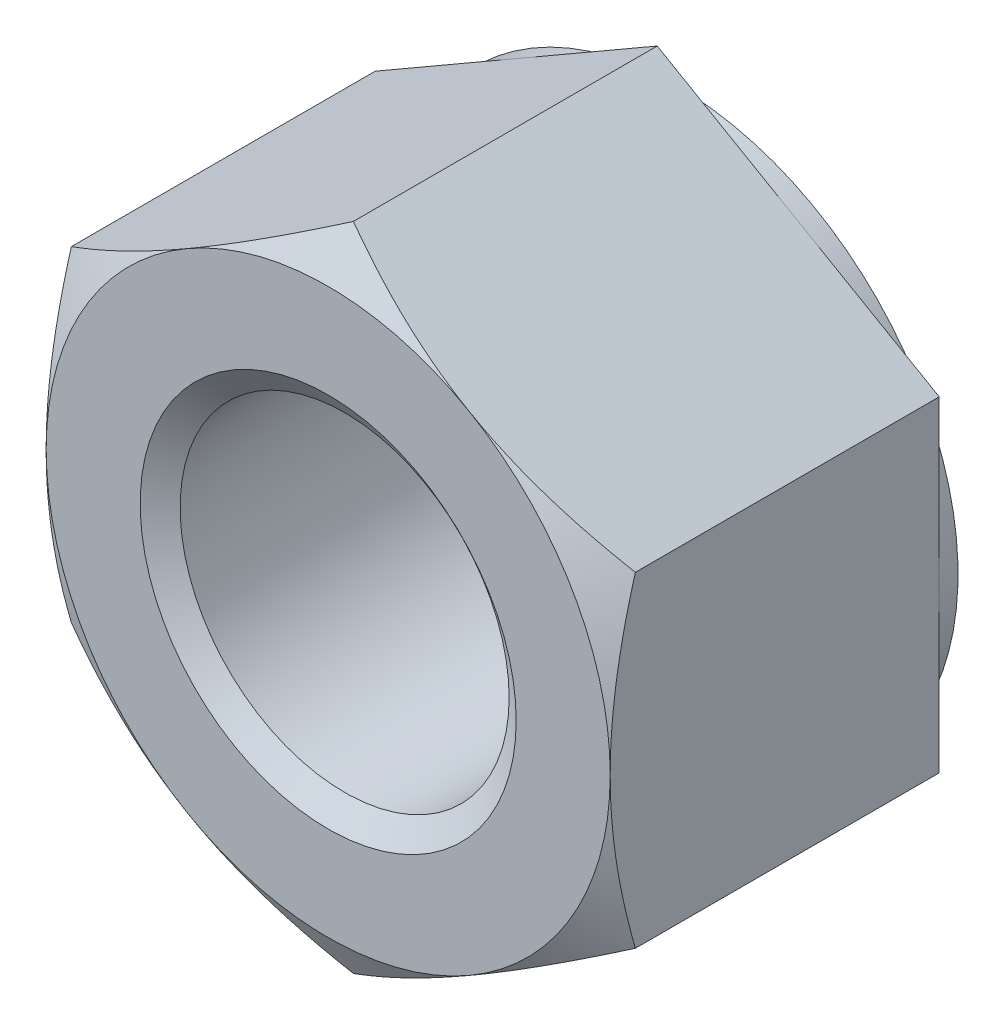
ISO-10303-21;
HEADER;
FILE_DESCRIPTION(('STEP AP214'),'2;1');
FILE_NAME('part.step','',(''),(''),'','','');
FILE_SCHEMA(('AUTOMOTIVE_DESIGN { 1 0 10303 214 1 1 1 1 }'));
ENDSEC;
DATA;
#1=APPLICATION_CONTEXT('core data for automotive mechanical design processes');
#2=APPLICATION_PROTOCOL_DEFINITION('international standard','automotive_design',2000,#1);
#3=PRODUCT_CONTEXT('',#1,'mechanical');
#4=PRODUCT('Part','Part','',(#3));
#5=PRODUCT_RELATED_PRODUCT_CATEGORY('part','',(#4));
#6=PRODUCT_DEFINITION_FORMATION('','',#4);
#7=PRODUCT_DEFINITION_CONTEXT('part definition',#1,'design');
#8=PRODUCT_DEFINITION('design','',#6,#7);
#9=PRODUCT_DEFINITION_SHAPE('','',#8);
#10=(LENGTH_UNIT() NAMED_UNIT(*) SI_UNIT(.MILLI.,.METRE.));
#11=(NAMED_UNIT(*) PLANE_ANGLE_UNIT() SI_UNIT($,.RADIAN.));
#12=(NAMED_UNIT(*) SI_UNIT($,.STERADIAN.) SOLID_ANGLE_UNIT());
#13=UNCERTAINTY_MEASURE_WITH_UNIT(LENGTH_MEASURE(1.E-05),#10,'distance_accuracy_value','');
#14=(GEOMETRIC_REPRESENTATION_CONTEXT(3) GLOBAL_UNCERTAINTY_ASSIGNED_CONTEXT((#13)) GLOBAL_UNIT_ASSIGNED_CONTEXT((#10,
#11,#12)) REPRESENTATION_CONTEXT('',''));
#15=CARTESIAN_POINT('',(0.,0.,0.));
#16=DIRECTION('',(0.,0.,1.));
#17=DIRECTION('',(1.,0.,0.));
#18=AXIS2_PLACEMENT_3D('',#15,#16,#17);
#19=CARTESIAN_POINT('',(0.,0.,-14.8));
#20=DIRECTION('',(0.,0.,1.));
#21=DIRECTION('',(1.,0.,0.));
#22=AXIS2_PLACEMENT_3D('',#19,#20,#21);
#23=CYLINDRICAL_SURFACE('',#22,7.);
#24=CARTESIAN_POINT('',(0.,0.,-0.700207538209714));
#25=DIRECTION('',(0.,0.,1.));
#26=DIRECTION('',(1.,0.,0.));
#27=AXIS2_PLACEMENT_3D('',#24,#25,#26);
#28=CIRCLE('',#27,7.);
#29=CARTESIAN_POINT('',(7.00000000000002,0.,-0.700207538209714));
#30=VERTEX_POINT('',#29);
#31=EDGE_CURVE('E167',#30,#30,#28,.F.);
#32=ORIENTED_EDGE('',*,*,#31,.F.);
#33=EDGE_LOOP('',(#32));
#34=FACE_BOUND('',#33,.T.);
#35=CARTESIAN_POINT('',(0.,0.,-14.0743924617903));
#36=DIRECTION('',(0.,0.,-1.));
#37=DIRECTION('',(-1.,0.,0.));
#38=AXIS2_PLACEMENT_3D('',#35,#36,#37);
#39=CIRCLE('',#38,7.);
#40=CARTESIAN_POINT('',(-7.00000000000002,0.,-14.0743924617903));
#41=VERTEX_POINT('',#40);
#42=EDGE_CURVE('E52',#41,#41,#39,.F.);
#43=ORIENTED_EDGE('',*,*,#42,.F.);
#44=EDGE_LOOP('',(#43));
#45=FACE_BOUND('',#44,.T.);
#46=ADVANCED_FACE('F47',(#34,#45),#23,.F.);
#47=CARTESIAN_POINT('',(0.,13.8564064605511,-14.8));
#48=DIRECTION('',(-0.500000000000003,0.866025403784441,0.));
#49=DIRECTION('',(-0.866025403784441,-0.500000000000003,0.));
#50=AXIS2_PLACEMENT_3D('',#47,#48,#49);
#51=PLANE('',#50);
#52=DIRECTION('',(0.,0.,1.));
#53=VECTOR('',#52,1.);
#54=CARTESIAN_POINT('',(-12.,6.9282032302755,-14.8));
#55=LINE('',#54,#53);
#56=CARTESIAN_POINT('',(-12.,6.9282032302755,-14.));
#57=VERTEX_POINT('',#56);
#58=CARTESIAN_POINT('',(-12.,6.9282032302755,-1.0717967697245));
#59=VERTEX_POINT('',#58);
#60=EDGE_CURVE('E325',#57,#59,#55,.T.);
#61=ORIENTED_EDGE('',*,*,#60,.T.);
#62=CARTESIAN_POINT('',(-12.0002,6.92808776022166,-1.07186343722449));
#63=CARTESIAN_POINT('',(-11.7364142047578,7.08038456011322,-0.983949632185901));
#64=CARTESIAN_POINT('',(-11.4716448806183,7.23324920067835,-0.900025997556721));
#65=CARTESIAN_POINT('',(-10.9399829834704,7.54020434011455,-0.741266218872904));
#66=CARTESIAN_POINT('',(-10.673089742707,7.69429522451419,-0.666433063673642));
#67=CARTESIAN_POINT('',(-9.86810959402106,8.15905073005032,-0.457017539854202));
#68=CARTESIAN_POINT('',(-9.32684492617496,8.4715500317341,-0.337903236722902));
#69=CARTESIAN_POINT('',(-8.51686717084506,8.93919090681143,-0.198231061003196));
#70=CARTESIAN_POINT('',(-8.25057389951868,9.0929353986951,-0.158443797040496));
#71=CARTESIAN_POINT('',(-7.71675440130321,9.40113622968847,-0.0917233692171395));
#72=CARTESIAN_POINT('',(-7.44922815078267,9.5555925824418,-0.0647904527678221));
#73=CARTESIAN_POINT('',(-6.9137296336747,9.86476279544474,-0.0244685919169799));
#74=CARTESIAN_POINT('',(-6.64575827793134,10.0194761298183,-0.0110635528823812));
#75=CARTESIAN_POINT('',(-6.109567267726,10.3290461538974,0.00191690624279675));
#76=CARTESIAN_POINT('',(-5.84134762119197,10.4839028390257,0.00149275363726585));
#77=CARTESIAN_POINT('',(-5.33991062121591,10.7734076259435,-0.0122200193427782));
#78=CARTESIAN_POINT('',(-5.10665750682228,10.908076374328,-0.0238359825785691));
#79=CARTESIAN_POINT('',(-4.64068775826929,11.1771041340894,-0.0573080088724415));
#80=CARTESIAN_POINT('',(-4.40797116322828,11.3114631228812,-0.0791647962662738));
#81=CARTESIAN_POINT('',(-3.94320092395709,11.5797983456357,-0.13273741654296));
#82=CARTESIAN_POINT('',(-3.71114798763804,11.7137741708858,-0.164461392492977));
#83=CARTESIAN_POINT('',(-3.24813003269506,11.9810977118117,-0.237211775670496));
#84=CARTESIAN_POINT('',(-3.01716508910649,12.1144453841659,-0.278238815183254));
#85=CARTESIAN_POINT('',(-2.31605804123636,12.5192297269845,-0.416311653281863));
#86=CARTESIAN_POINT('',(-1.84794625372149,12.7894941935171,-0.527124888339393));
#87=CARTESIAN_POINT('',(-0.91870289240859,13.3259930983137,-0.778625766937946));
#88=CARTESIAN_POINT('',(-0.457559420707853,13.5922344058352,-0.919254342659433));
#89=CARTESIAN_POINT('',(0.000200000000001717,13.856521930605,-1.07186343722449));
#90=B_SPLINE_CURVE_WITH_KNOTS('',3,(#62,#63,#64,#65,#66,#67,#68,#69,#70,#71,#72,#73,#74,#75,#76,
#77,#78,#79,#80,#81,#82,#83,#84,#85,#86,#87,#88,#89),.UNSPECIFIED.,.F.,.F.,(4,2,2,2,2,2,2,2,2,2,
2,2,2,4),(0.,0.951004872251243,1.90232158356438,3.8090046616137,4.73894551413572,
5.66890426477612,6.59775529889868,7.52657763276933,8.33514643820581,9.14377244252753,
9.9530675579977,10.7624176939264,12.4167102786893,14.0677556316692),.UNSPECIFIED.);
#91=CARTESIAN_POINT('',(-6.00000000000004,10.3923048454133,0.));
#92=VERTEX_POINT('',#91);
#93=EDGE_CURVE('E72',#59,#92,#90,.T.);
#94=ORIENTED_EDGE('',*,*,#93,.T.);
#95=CARTESIAN_POINT('',(0.,13.8564064605511,-1.0717967697245));
#96=VERTEX_POINT('',#95);
#97=EDGE_CURVE('E186',#92,#96,#90,.T.);
#98=ORIENTED_EDGE('',*,*,#97,.T.);
#99=DIRECTION('',(0.,0.,1.));
#100=VECTOR('',#99,1.);
#101=CARTESIAN_POINT('',(0.,13.8564064605511,-14.8));
#102=LINE('',#101,#100);
#103=CARTESIAN_POINT('',(0.,13.8564064605511,-14.));
#104=VERTEX_POINT('',#103);
#105=EDGE_CURVE('E308',#104,#96,#102,.T.);
#106=ORIENTED_EDGE('',*,*,#105,.F.);
#107=DIRECTION('',(-0.866025403784441,-0.500000000000003,0.));
#108=VECTOR('',#107,1.);
#109=CARTESIAN_POINT('',(0.,13.8564064605511,-14.));
#110=LINE('',#109,#108);
#111=CARTESIAN_POINT('',(-6.00000000000004,10.3923048454133,-14.));
#112=VERTEX_POINT('',#111);
#113=EDGE_CURVE('E293',#104,#112,#110,.T.);
#114=ORIENTED_EDGE('',*,*,#113,.T.);
#115=EDGE_CURVE('E288',#112,#57,#110,.T.);
#116=ORIENTED_EDGE('',*,*,#115,.T.);
#117=EDGE_LOOP('',(#61,#94,#98,#106,#114,#116));
#118=FACE_BOUND('',#117,.T.);
#119=ADVANCED_FACE('F49',(#118),#51,.T.);
#120=CARTESIAN_POINT('',(12.,6.9282032302755,-14.8));
#121=DIRECTION('',(0.500000000000003,0.866025403784441,0.));
#122=DIRECTION('',(-0.866025403784441,0.500000000000003,0.));
#123=AXIS2_PLACEMENT_3D('',#120,#121,#122);
#124=PLANE('',#123);
#125=ORIENTED_EDGE('',*,*,#105,.T.);
#126=CARTESIAN_POINT('',(-0.000199999999996563,13.856521930605,-1.07186343722449));
#127=CARTESIAN_POINT('',(0.263585795242252,13.7042251307134,-0.98394963218589));
#128=CARTESIAN_POINT('',(0.528355119381786,13.5513604901483,-0.900025997556702));
#129=CARTESIAN_POINT('',(1.06001701652965,13.2444053507121,-0.741266218872878));
#130=CARTESIAN_POINT('',(1.32691025729306,13.0903144663124,-0.666433063673616));
#131=CARTESIAN_POINT('',(2.13189040597901,12.6255589607763,-0.457017539854177));
#132=CARTESIAN_POINT('',(2.6731550738251,12.3130596590925,-0.337903236722872));
#133=CARTESIAN_POINT('',(3.48313282915501,11.8454187840152,-0.198231061003164));
#134=CARTESIAN_POINT('',(3.74942610048139,11.6916742921315,-0.158443797040464));
#135=CARTESIAN_POINT('',(4.28324559869686,11.3834734611381,-0.0917233692171084));
#136=CARTESIAN_POINT('',(4.5507718492174,11.2290171083848,-0.064790452767791));
#137=CARTESIAN_POINT('',(5.08627036632538,10.9198468953819,-0.0244685919169424));
#138=CARTESIAN_POINT('',(5.35424172206876,10.7651335610083,-0.0110635528823373));
#139=CARTESIAN_POINT('',(5.89043273227407,10.4555635369292,0.00191690624282098));
#140=CARTESIAN_POINT('',(6.15865237880807,10.3007068518009,0.00149275363726413));
#141=CARTESIAN_POINT('',(6.66008937878414,10.0112020648831,-0.0122200193427767));
#142=CARTESIAN_POINT('',(6.89334249317779,9.87653331649856,-0.0238359825785449));
#143=CARTESIAN_POINT('',(7.35931224173081,9.60750555673726,-0.0573080088724005));
#144=CARTESIAN_POINT('',(7.59202883677181,9.47314656794544,-0.0791647962662387));
#145=CARTESIAN_POINT('',(8.05679907604298,9.2048113451909,-0.13273741654293));
#146=CARTESIAN_POINT('',(8.28885201236204,9.07083551994085,-0.164461392492945));
#147=CARTESIAN_POINT('',(8.75186996730502,8.80351197901489,-0.237211775670463));
#148=CARTESIAN_POINT('',(8.98283491089358,8.67016430666067,-0.27823881518322));
#149=CARTESIAN_POINT('',(9.68394195876371,8.2653799638421,-0.416311653281827));
#150=CARTESIAN_POINT('',(10.1520537462786,7.99511549730956,-0.527124888339354));
#151=CARTESIAN_POINT('',(11.0812971075915,7.45861659251289,-0.778625766937911));
#152=CARTESIAN_POINT('',(11.5424405792922,7.19237528499143,-0.919254342659406));
#153=CARTESIAN_POINT('',(12.0002,6.92808776022166,-1.07186343722449));
#154=B_SPLINE_CURVE_WITH_KNOTS('',3,(#126,#127,#128,#129,#130,#131,#132,#133,#134,#135,#136,
#137,#138,#139,#140,#141,#142,#143,#144,#145,#146,#147,#148,#149,#150,#151,#152,#153),
.UNSPECIFIED.,.F.,.F.,(4,2,2,2,2,2,2,2,2,2,2,2,2,4),(0.,0.951004872251253,1.90232158356439,
3.80900466161372,4.73894551413575,5.66890426477615,6.59775529889872,7.52657763276937,
8.33514643820586,9.14377244252757,9.95306755799773,10.7624176939265,12.4167102786893,
14.0677556316692),.UNSPECIFIED.);
#155=CARTESIAN_POINT('',(6.00000000000004,10.3923048454133,0.));
#156=VERTEX_POINT('',#155);
#157=EDGE_CURVE('E183',#96,#156,#154,.T.);
#158=ORIENTED_EDGE('',*,*,#157,.T.);
#159=CARTESIAN_POINT('',(12.,6.92820323027553,-1.0717967697245));
#160=VERTEX_POINT('',#159);
#161=EDGE_CURVE('E160',#156,#160,#154,.T.);
#162=ORIENTED_EDGE('',*,*,#161,.T.);
#163=DIRECTION('',(0.,0.,1.));
#164=VECTOR('',#163,1.);
#165=CARTESIAN_POINT('',(12.,6.9282032302755,-14.8));
#166=LINE('',#165,#164);
#167=CARTESIAN_POINT('',(12.,6.9282032302755,-14.));
#168=VERTEX_POINT('',#167);
#169=EDGE_CURVE('E178',#168,#160,#166,.T.);
#170=ORIENTED_EDGE('',*,*,#169,.F.);
#171=DIRECTION('',(-0.866025403784441,0.500000000000003,0.));
#172=VECTOR('',#171,1.);
#173=CARTESIAN_POINT('',(12.,6.9282032302755,-14.));
#174=LINE('',#173,#172);
#175=CARTESIAN_POINT('',(6.00000000000004,10.3923048454133,-14.));
#176=VERTEX_POINT('',#175);
#177=EDGE_CURVE('E303',#168,#176,#174,.T.);
#178=ORIENTED_EDGE('',*,*,#177,.T.);
#179=EDGE_CURVE('E298',#176,#104,#174,.T.);
#180=ORIENTED_EDGE('',*,*,#179,.T.);
#181=EDGE_LOOP('',(#125,#158,#162,#170,#178,#180));
#182=FACE_BOUND('',#181,.T.);
#183=ADVANCED_FACE('F261',(#182),#124,.T.);
#184=CARTESIAN_POINT('',(12.,6.9282032302755,-14.8));
#185=DIRECTION('',(-1.,0.,0.));
#186=DIRECTION('',(0.,0.,1.));
#187=AXIS2_PLACEMENT_3D('',#184,#185,#186);
#188=PLANE('',#187);
#189=CARTESIAN_POINT('',(12.0000000000001,-18.3746159698766,-5.74232046372183));
#190=CARTESIAN_POINT('',(12.0000000000001,-18.1111918264859,-5.61498513923389));
#191=CARTESIAN_POINT('',(12.,-17.8474492817227,-5.48830883121234));
#192=CARTESIAN_POINT('',(12.,-17.3192601229197,-5.23642551678936));
#193=CARTESIAN_POINT('',(12.,-17.0548135011845,-5.11121852652884));
#194=CARTESIAN_POINT('',(12.,-16.2602391639796,-4.73799215348734));
#195=CARTESIAN_POINT('',(12.,-15.7289626157829,-4.49240888485756));
#196=CARTESIAN_POINT('',(12.,-14.659698083513,-4.0079188757381));
#197=CARTESIAN_POINT('',(12.,-14.1216890909037,-3.76905838470961));
#198=CARTESIAN_POINT('',(12.,-13.0412497182117,-3.30159295667769));
#199=CARTESIAN_POINT('',(12.,-12.4988195703414,-3.07298748509958));
#200=CARTESIAN_POINT('',(12.,-11.4019415707821,-2.62605165906471));
#201=CARTESIAN_POINT('',(12.,-10.8474279352457,-2.40788190707403));
#202=CARTESIAN_POINT('',(12.,-9.73185625315833,-1.98862863844566));
#203=CARTESIAN_POINT('',(12.,-9.17079748637073,-1.78754702277386));
#204=CARTESIAN_POINT('',(12.,-8.04241377293584,-1.40787575411279));
#205=CARTESIAN_POINT('',(12.,-7.47510504864868,-1.22923828322895));
#206=CARTESIAN_POINT('',(12.,-6.33236790679921,-0.900248091383252));
#207=CARTESIAN_POINT('',(12.,-5.75694211908223,-0.749886425780382));
#208=CARTESIAN_POINT('',(12.,-4.88760620841683,-0.551055055862476));
#209=CARTESIAN_POINT('',(12.,-4.59673300881532,-0.489219616047522));
#210=CARTESIAN_POINT('',(12.,-4.01305048396675,-0.375428819843002));
#211=CARTESIAN_POINT('',(12.,-3.7202412010005,-0.323473248426317));
#212=CARTESIAN_POINT('',(12.,-3.13287727735238,-0.230362398208384));
#213=CARTESIAN_POINT('',(12.,-2.83832249610625,-0.189208001647554));
#214=CARTESIAN_POINT('',(12.,-2.24782315371645,-0.118528970775321));
#215=CARTESIAN_POINT('',(12.,-1.95187864865479,-0.0890038711785699));
#216=CARTESIAN_POINT('',(12.,-1.36089234495212,-0.0423753881209493));
#217=CARTESIAN_POINT('',(12.,-1.06585670022768,-0.0251945164064824));
#218=CARTESIAN_POINT('',(12.,-0.475323226777268,-0.00334573482666582));
#219=CARTESIAN_POINT('',(12.,-0.179825404103191,0.00132233753524057));
#220=CARTESIAN_POINT('',(12.,0.411018209391825,-0.00196522741275844));
#221=CARTESIAN_POINT('',(12.,0.706364019605425,-0.00991732191377093));
#222=CARTESIAN_POINT('',(12.,1.29646300031969,-0.0382476009171538));
#223=CARTESIAN_POINT('',(12.,1.59121614048714,-0.058626405962484));
#224=CARTESIAN_POINT('',(12.,2.30560702878384,-0.122652790995235));
#225=CARTESIAN_POINT('',(12.,2.72469590429756,-0.172526583575453));
#226=CARTESIAN_POINT('',(12.,3.55966217170488,-0.294627457249488));
#227=CARTESIAN_POINT('',(12.,3.9755386555205,-0.366860637779305));
#228=CARTESIAN_POINT('',(12.,4.80373712034423,-0.531118495407791));
#229=CARTESIAN_POINT('',(12.,5.21605535435658,-0.623161886116669));
#230=CARTESIAN_POINT('',(12.,6.03644960579826,-0.82423148527522));
#231=CARTESIAN_POINT('',(12.,6.44452601892293,-0.93325609419906));
#232=CARTESIAN_POINT('',(12.,7.26648771462056,-1.16853096392264));
#233=CARTESIAN_POINT('',(12.,7.68027019418272,-1.29513795555177));
#234=CARTESIAN_POINT('',(12.,8.5034606587473,-1.56085760789332));
#235=CARTESIAN_POINT('',(12.,8.91287144608806,-1.69996164292634));
#236=CARTESIAN_POINT('',(12.,9.72567950730298,-1.98781971346773));
#237=CARTESIAN_POINT('',(12.,10.1290976583403,-2.13651502520382));
#238=CARTESIAN_POINT('',(12.,10.7318330075332,-2.36605061706381));
#239=CARTESIAN_POINT('',(12.,10.9323890596672,-2.44366199159915));
#240=CARTESIAN_POINT('',(12.,11.3327210550073,-2.60085858346849));
#241=CARTESIAN_POINT('',(12.,11.5324970162612,-2.68044375482057));
#242=CARTESIAN_POINT('',(12.,11.7319109696003,-2.76092701962528));
#243=B_SPLINE_CURVE_WITH_KNOTS('',3,(#189,#190,#191,#192,#193,#194,#195,#196,#197,#198,#199,
#200,#201,#202,#203,#204,#205,#206,#207,#208,#209,#210,#211,#212,#213,#214,#215,#216,#217,#218,
#219,#220,#221,#222,#223,#224,#225,#226,#227,#228,#229,#230,#231,#232,#233,#234,#235,#236,#237,
#238,#239,#240,#241,#242),.UNSPECIFIED.,.F.,.F.,(4,2,2,2,2,2,2,2,2,2,2,2,2,2,2,2,2,2,2,2,2,2,2,
2,2,2,4),(0.,0.877756274437959,1.75552218228204,3.51133949648298,5.27720464406482,
7.04297763322993,8.83042883460969,10.6180786210058,12.4018527456128,14.1850616464292,
15.0770405430691,15.9690000243079,16.861032338177,17.7530289584235,18.63937614315,
19.5257118173377,20.4117987180715,21.2979298702602,22.5633628824822,23.8291413978917,
25.0961209138468,26.3629811602517,27.6608948763425,28.9579195329089,30.2476436633466,
30.8927835422015,31.5379084058554),.UNSPECIFIED.);
#244=CARTESIAN_POINT('',(12.,-6.92820323027554,-1.0717967697245));
#245=VERTEX_POINT('',#244);
#246=CARTESIAN_POINT('',(12.,0.,0.));
#247=VERTEX_POINT('',#246);
#248=EDGE_CURVE('E140',#245,#247,#243,.T.);
#249=ORIENTED_EDGE('',*,*,#248,.F.);
#250=DIRECTION('',(0.,0.,1.));
#251=VECTOR('',#250,1.);
#252=CARTESIAN_POINT('',(12.,-6.92820323027554,-14.8));
#253=LINE('',#252,#251);
#254=CARTESIAN_POINT('',(12.,-6.92820323027554,-14.));
#255=VERTEX_POINT('',#254);
#256=EDGE_CURVE('E315',#255,#245,#253,.T.);
#257=ORIENTED_EDGE('',*,*,#256,.F.);
#258=DIRECTION('',(0.,-1.,0.));
#259=VECTOR('',#258,1.);
#260=CARTESIAN_POINT('',(12.,6.9282032302755,-14.));
#261=LINE('',#260,#259);
#262=CARTESIAN_POINT('',(12.,0.,-14.));
#263=VERTEX_POINT('',#262);
#264=EDGE_CURVE('E304',#263,#255,#261,.T.);
#265=ORIENTED_EDGE('',*,*,#264,.F.);
#266=EDGE_CURVE('E307',#168,#263,#261,.T.);
#267=ORIENTED_EDGE('',*,*,#266,.F.);
#268=ORIENTED_EDGE('',*,*,#169,.T.);
#269=EDGE_CURVE('E154',#247,#160,#243,.T.);
#270=ORIENTED_EDGE('',*,*,#269,.F.);
#271=EDGE_LOOP('',(#249,#257,#265,#267,#268,#270));
#272=FACE_BOUND('',#271,.T.);
#273=ADVANCED_FACE('F175',(#272),#188,.F.);
#274=CARTESIAN_POINT('',(0.,-13.8564064605511,-14.8));
#275=DIRECTION('',(0.500000000000003,-0.866025403784441,0.));
#276=DIRECTION('',(0.866025403784441,0.500000000000002,0.));
#277=AXIS2_PLACEMENT_3D('',#274,#275,#276);
#278=PLANE('',#277);
#279=ORIENTED_EDGE('',*,*,#256,.T.);
#280=CARTESIAN_POINT('',(12.0002,-6.92808776022169,-1.07186343722449));
#281=CARTESIAN_POINT('',(11.7364142047578,-7.0803845601132,-0.983949632185883));
#282=CARTESIAN_POINT('',(11.4716448806182,-7.23324920067832,-0.900025997556693));
#283=CARTESIAN_POINT('',(10.9399829834704,-7.5402043401145,-0.741266218872867));
#284=CARTESIAN_POINT('',(10.673089742707,-7.69429522451415,-0.666433063673607));
#285=CARTESIAN_POINT('',(9.86810959402102,-8.15905073005028,-0.45701753985417));
#286=CARTESIAN_POINT('',(9.32684492617492,-8.47155003173406,-0.337903236722869));
#287=CARTESIAN_POINT('',(8.51686717084502,-8.93919090681139,-0.198231061003161));
#288=CARTESIAN_POINT('',(8.25057389951864,-9.09293539869506,-0.158443797040461));
#289=CARTESIAN_POINT('',(7.71675440130317,-9.40113622968843,-0.0917233692171059));
#290=CARTESIAN_POINT('',(7.44922815078263,-9.55559258244176,-0.06479045276779));
#291=CARTESIAN_POINT('',(6.91372963367465,-9.86476279544469,-0.0244685919169404));
#292=CARTESIAN_POINT('',(6.64575827793128,-10.0194761298182,-0.011063552882333));
#293=CARTESIAN_POINT('',(6.10956726772596,-10.3290461538973,0.00191690624281709));
#294=CARTESIAN_POINT('',(5.84134762119196,-10.4839028390257,0.00149275363724956));
#295=CARTESIAN_POINT('',(5.3399106212159,-10.7734076259435,-0.0122200193427899));
#296=CARTESIAN_POINT('',(5.10665750682224,-10.908076374328,-0.0238359825785489));
#297=CARTESIAN_POINT('',(4.64068775826923,-11.1771041340893,-0.0573080088723976));
#298=CARTESIAN_POINT('',(4.40797116322823,-11.3114631228811,-0.0791647962662381));
#299=CARTESIAN_POINT('',(3.94320092395705,-11.5797983456357,-0.132737416542931));
#300=CARTESIAN_POINT('',(3.71114798763799,-11.7137741708857,-0.164461392492947));
#301=CARTESIAN_POINT('',(3.24813003269502,-11.9810977118117,-0.237211775670465));
#302=CARTESIAN_POINT('',(3.01716508910646,-12.1144453841659,-0.278238815183223));
#303=CARTESIAN_POINT('',(2.31605804123633,-12.5192297269845,-0.41631165328183));
#304=CARTESIAN_POINT('',(1.84794625372147,-12.789494193517,-0.527124888339355));
#305=CARTESIAN_POINT('',(0.918702892408575,-13.3259930983137,-0.778625766937916));
#306=CARTESIAN_POINT('',(0.457559420707843,-13.5922344058351,-0.919254342659417));
#307=CARTESIAN_POINT('',(-0.000199999999999733,-13.8565219306049,-1.07186343722451));
#308=B_SPLINE_CURVE_WITH_KNOTS('',3,(#280,#281,#282,#283,#284,#285,#286,#287,#288,#289,#290,
#291,#292,#293,#294,#295,#296,#297,#298,#299,#300,#301,#302,#303,#304,#305,#306,#307),
.UNSPECIFIED.,.F.,.F.,(4,2,2,2,2,2,2,2,2,2,2,2,2,4),(0.,0.951004872251251,1.90232158356439,
3.80900466161371,4.73894551413573,5.66890426477613,6.5977552988987,7.52657763276935,
8.33514643820584,9.14377244252754,9.95306755799771,10.7624176939264,12.4167102786893,
14.0677556316692),.UNSPECIFIED.);
#309=CARTESIAN_POINT('',(6.00000000000003,-10.3923048454133,0.));
#310=VERTEX_POINT('',#309);
#311=EDGE_CURVE('E147',#245,#310,#308,.T.);
#312=ORIENTED_EDGE('',*,*,#311,.T.);
#313=CARTESIAN_POINT('',(0.,-13.856406460551,-1.0717967697245));
#314=VERTEX_POINT('',#313);
#315=EDGE_CURVE('E194',#310,#314,#308,.T.);
#316=ORIENTED_EDGE('',*,*,#315,.T.);
#317=DIRECTION('',(0.,0.,1.));
#318=VECTOR('',#317,1.);
#319=CARTESIAN_POINT('',(0.,-13.8564064605511,-14.8));
#320=LINE('',#319,#318);
#321=CARTESIAN_POINT('',(0.,-13.8564064605511,-14.));
#322=VERTEX_POINT('',#321);
#323=EDGE_CURVE('E318',#322,#314,#320,.T.);
#324=ORIENTED_EDGE('',*,*,#323,.F.);
#325=DIRECTION('',(0.866025403784441,0.500000000000002,0.));
#326=VECTOR('',#325,1.);
#327=CARTESIAN_POINT('',(0.,-13.8564064605511,-14.));
#328=LINE('',#327,#326);
#329=CARTESIAN_POINT('',(6.00000000000005,-10.3923048454133,-14.));
#330=VERTEX_POINT('',#329);
#331=EDGE_CURVE('E294',#322,#330,#328,.T.);
#332=ORIENTED_EDGE('',*,*,#331,.T.);
#333=EDGE_CURVE('E299',#330,#255,#328,.T.);
#334=ORIENTED_EDGE('',*,*,#333,.T.);
#335=EDGE_LOOP('',(#279,#312,#316,#324,#332,#334));
#336=FACE_BOUND('',#335,.T.);
#337=ADVANCED_FACE('F242',(#336),#278,.T.);
#338=CARTESIAN_POINT('',(-12.,-6.92820323027553,-14.8));
#339=DIRECTION('',(-0.500000000000003,-0.866025403784441,0.));
#340=DIRECTION('',(0.866025403784441,-0.500000000000003,0.));
#341=AXIS2_PLACEMENT_3D('',#338,#339,#340);
#342=PLANE('',#341);
#343=ORIENTED_EDGE('',*,*,#323,.T.);
#344=CARTESIAN_POINT('',(0.000199999999998498,-13.8565219306049,-1.07186343722451));
#345=CARTESIAN_POINT('',(-0.263585795242271,-13.7042251307134,-0.983949632185901));
#346=CARTESIAN_POINT('',(-0.528355119381812,-13.5513604901483,-0.90002599755671));
#347=CARTESIAN_POINT('',(-1.06001701652968,-13.2444053507121,-0.741266218872884));
#348=CARTESIAN_POINT('',(-1.32691025729309,-13.0903144663124,-0.666433063673624));
#349=CARTESIAN_POINT('',(-2.13189040597903,-12.6255589607763,-0.457017539854187));
#350=CARTESIAN_POINT('',(-2.67315507382513,-12.3130596590925,-0.337903236722883));
#351=CARTESIAN_POINT('',(-3.48313282915503,-11.8454187840152,-0.198231061003176));
#352=CARTESIAN_POINT('',(-3.74942610048141,-11.6916742921315,-0.158443797040476));
#353=CARTESIAN_POINT('',(-4.28324559869688,-11.3834734611382,-0.0917233692171209));
#354=CARTESIAN_POINT('',(-4.55077184921742,-11.2290171083848,-0.0647904527678044));
#355=CARTESIAN_POINT('',(-5.0862703663254,-10.9198468953819,-0.024468591916956));
#356=CARTESIAN_POINT('',(-5.35424172206878,-10.7651335610083,-0.0110635528823503));
#357=CARTESIAN_POINT('',(-5.89043273227409,-10.4555635369292,0.00191690624280791));
#358=CARTESIAN_POINT('',(-6.15865237880809,-10.3007068518009,0.00149275363725034));
#359=CARTESIAN_POINT('',(-6.66008937878415,-10.0112020648831,-0.0122200193427906));
#360=CARTESIAN_POINT('',(-6.89334249317781,-9.87653331649858,-0.0238359825785585));
#361=CARTESIAN_POINT('',(-7.35931224173082,-9.60750555673728,-0.057308008872414));
#362=CARTESIAN_POINT('',(-7.59202883677182,-9.47314656794546,-0.0791647962662524));
#363=CARTESIAN_POINT('',(-8.05679907604299,-9.20481134519092,-0.132737416542943));
#364=CARTESIAN_POINT('',(-8.28885201236205,-9.07083551994087,-0.164461392492958));
#365=CARTESIAN_POINT('',(-8.75186996730503,-8.80351197901491,-0.237211775670475));
#366=CARTESIAN_POINT('',(-8.98283491089359,-8.67016430666069,-0.278238815183232));
#367=CARTESIAN_POINT('',(-9.68394195876372,-8.26537996384213,-0.416311653281839));
#368=CARTESIAN_POINT('',(-10.1520537462786,-7.99511549730958,-0.527124888339365));
#369=CARTESIAN_POINT('',(-11.0812971075915,-7.45861659251291,-0.778625766937921));
#370=CARTESIAN_POINT('',(-11.5424405792922,-7.19237528499145,-0.919254342659415));
#371=CARTESIAN_POINT('',(-12.0002,-6.92808776022169,-1.07186343722449));
#372=B_SPLINE_CURVE_WITH_KNOTS('',3,(#344,#345,#346,#347,#348,#349,#350,#351,#352,#353,#354,
#355,#356,#357,#358,#359,#360,#361,#362,#363,#364,#365,#366,#367,#368,#369,#370,#371),
.UNSPECIFIED.,.F.,.F.,(4,2,2,2,2,2,2,2,2,2,2,2,2,4),(0.,0.95100487225125,1.90232158356439,
3.80900466161372,4.73894551413574,5.66890426477614,6.59775529889871,7.52657763276936,
8.33514643820584,9.14377244252755,9.95306755799771,10.7624176939264,12.4167102786893,
14.0677556316692),.UNSPECIFIED.);
#373=CARTESIAN_POINT('',(-6.00000000000004,-10.3923048454133,0.));
#374=VERTEX_POINT('',#373);
#375=EDGE_CURVE('E236',#314,#374,#372,.T.);
#376=ORIENTED_EDGE('',*,*,#375,.T.);
#377=CARTESIAN_POINT('',(-12.,-6.92820323027553,-1.0717967697245));
#378=VERTEX_POINT('',#377);
#379=EDGE_CURVE('E227',#374,#378,#372,.T.);
#380=ORIENTED_EDGE('',*,*,#379,.T.);
#381=DIRECTION('',(0.,0.,1.));
#382=VECTOR('',#381,1.);
#383=CARTESIAN_POINT('',(-12.,-6.92820323027553,-14.8));
#384=LINE('',#383,#382);
#385=CARTESIAN_POINT('',(-12.,-6.92820323027553,-14.));
#386=VERTEX_POINT('',#385);
#387=EDGE_CURVE('E322',#386,#378,#384,.T.);
#388=ORIENTED_EDGE('',*,*,#387,.F.);
#389=DIRECTION('',(0.866025403784441,-0.500000000000003,0.));
#390=VECTOR('',#389,1.);
#391=CARTESIAN_POINT('',(-12.,-6.92820323027553,-14.));
#392=LINE('',#391,#390);
#393=CARTESIAN_POINT('',(-6.00000000000005,-10.3923048454133,-14.));
#394=VERTEX_POINT('',#393);
#395=EDGE_CURVE('E282',#386,#394,#392,.T.);
#396=ORIENTED_EDGE('',*,*,#395,.T.);
#397=EDGE_CURVE('E289',#394,#322,#392,.T.);
#398=ORIENTED_EDGE('',*,*,#397,.T.);
#399=EDGE_LOOP('',(#343,#376,#380,#388,#396,#398));
#400=FACE_BOUND('',#399,.T.);
#401=ADVANCED_FACE('F238',(#400),#342,.T.);
#402=CARTESIAN_POINT('',(-12.,6.9282032302755,-14.8));
#403=DIRECTION('',(-1.,0.,0.));
#404=DIRECTION('',(0.,0.,1.));
#405=AXIS2_PLACEMENT_3D('',#402,#403,#404);
#406=PLANE('',#405);
#407=ORIENTED_EDGE('',*,*,#387,.T.);
#408=CARTESIAN_POINT('',(-12.,-18.3746159698766,-5.74232046372183));
#409=CARTESIAN_POINT('',(-12.,-18.1111918264859,-5.61498513923389));
#410=CARTESIAN_POINT('',(-12.,-17.8474492817227,-5.48830883121233));
#411=CARTESIAN_POINT('',(-12.,-17.3192601229197,-5.23642551678936));
#412=CARTESIAN_POINT('',(-12.,-17.0548135011845,-5.11121852652884));
#413=CARTESIAN_POINT('',(-12.,-16.2602391639795,-4.73799215348733));
#414=CARTESIAN_POINT('',(-12.,-15.7289626157829,-4.49240888485756));
#415=CARTESIAN_POINT('',(-12.,-14.659698083513,-4.0079188757381));
#416=CARTESIAN_POINT('',(-12.,-14.1216890909037,-3.76905838470961));
#417=CARTESIAN_POINT('',(-12.,-13.0412497182117,-3.30159295667769));
#418=CARTESIAN_POINT('',(-12.,-12.4988195703414,-3.07298748509957));
#419=CARTESIAN_POINT('',(-12.,-11.4019415707821,-2.62605165906471));
#420=CARTESIAN_POINT('',(-12.,-10.8474279352457,-2.40788190707402));
#421=CARTESIAN_POINT('',(-12.,-9.73185625315832,-1.98862863844566));
#422=CARTESIAN_POINT('',(-12.,-9.17079748637072,-1.78754702277386));
#423=CARTESIAN_POINT('',(-12.,-8.04241377293583,-1.40787575411279));
#424=CARTESIAN_POINT('',(-12.,-7.47510504864868,-1.22923828322895));
#425=CARTESIAN_POINT('',(-12.,-6.3323679067992,-0.900248091383249));
#426=CARTESIAN_POINT('',(-12.,-5.75694211908223,-0.749886425780371));
#427=CARTESIAN_POINT('',(-12.,-4.88760620841683,-0.55105505586247));
#428=CARTESIAN_POINT('',(-12.,-4.59673300881532,-0.489219616047521));
#429=CARTESIAN_POINT('',(-12.,-4.01305048396675,-0.375428819843003));
#430=CARTESIAN_POINT('',(-12.,-3.7202412010005,-0.323473248426318));
#431=CARTESIAN_POINT('',(-12.,-3.13287727735238,-0.230362398208384));
#432=CARTESIAN_POINT('',(-12.,-2.83832249610625,-0.189208001647554));
#433=CARTESIAN_POINT('',(-12.,-2.24782315371645,-0.118528970775322));
#434=CARTESIAN_POINT('',(-12.,-1.95187864865479,-0.0890038711785699));
#435=CARTESIAN_POINT('',(-12.,-1.36089234495212,-0.0423753881209492));
#436=CARTESIAN_POINT('',(-12.,-1.06585670022768,-0.0251945164064824));
#437=CARTESIAN_POINT('',(-12.,-0.475323226777266,-0.00334573482666576));
#438=CARTESIAN_POINT('',(-12.,-0.179825404103188,0.00132233753524082));
#439=CARTESIAN_POINT('',(-12.,0.41101820939183,-0.00196522741275869));
#440=CARTESIAN_POINT('',(-12.,0.70636401960543,-0.00991732191377182));
#441=CARTESIAN_POINT('',(-12.,1.29646300031969,-0.0382476009171548));
#442=CARTESIAN_POINT('',(-12.,1.59121614048714,-0.0586264059624844));
#443=CARTESIAN_POINT('',(-12.,2.30560702878384,-0.122652790995235));
#444=CARTESIAN_POINT('',(-12.,2.72469590429756,-0.172526583575454));
#445=CARTESIAN_POINT('',(-12.,3.55966217170489,-0.294627457249489));
#446=CARTESIAN_POINT('',(-12.,3.97553865552051,-0.366860637779306));
#447=CARTESIAN_POINT('',(-12.,4.80373712034424,-0.531118495407792));
#448=CARTESIAN_POINT('',(-12.,5.21605535435658,-0.62316188611667));
#449=CARTESIAN_POINT('',(-12.,6.03644960579826,-0.824231485275221));
#450=CARTESIAN_POINT('',(-12.,6.44452601892294,-0.933256094199062));
#451=CARTESIAN_POINT('',(-12.,7.26648771462057,-1.16853096392264));
#452=CARTESIAN_POINT('',(-12.,7.68027019418273,-1.29513795555177));
#453=CARTESIAN_POINT('',(-12.,8.50346065874731,-1.56085760789333));
#454=CARTESIAN_POINT('',(-12.,8.91287144608807,-1.69996164292635));
#455=CARTESIAN_POINT('',(-12.,9.72567950730299,-1.98781971346774));
#456=CARTESIAN_POINT('',(-12.,10.1290976583403,-2.13651502520382));
#457=CARTESIAN_POINT('',(-12.,10.7318330075332,-2.36605061706381));
#458=CARTESIAN_POINT('',(-12.,10.9323890596672,-2.44366199159916));
#459=CARTESIAN_POINT('',(-12.,11.3327210550073,-2.6008585834685));
#460=CARTESIAN_POINT('',(-12.,11.5324970162612,-2.68044375482058));
#461=CARTESIAN_POINT('',(-12.,11.7319109696003,-2.76092701962528));
#462=B_SPLINE_CURVE_WITH_KNOTS('',3,(#408,#409,#410,#411,#412,#413,#414,#415,#416,#417,#418,
#419,#420,#421,#422,#423,#424,#425,#426,#427,#428,#429,#430,#431,#432,#433,#434,#435,#436,#437,
#438,#439,#440,#441,#442,#443,#444,#445,#446,#447,#448,#449,#450,#451,#452,#453,#454,#455,#456,
#457,#458,#459,#460,#461),.UNSPECIFIED.,.F.,.F.,(4,2,2,2,2,2,2,2,2,2,2,2,2,2,2,2,2,2,2,2,2,2,2,
2,2,2,4),(0.,0.877756274437958,1.75552218228204,3.51133949648298,5.27720464406481,
7.04297763322993,8.83042883460969,10.6180786210057,12.4018527456128,14.1850616464291,
15.0770405430691,15.9690000243079,16.861032338177,17.7530289584234,18.63937614315,
19.5257118173377,20.4117987180715,21.2979298702602,22.5633628824822,23.8291413978917,
25.0961209138468,26.3629811602517,27.6608948763425,28.9579195329088,30.2476436633466,
30.8927835422015,31.5379084058554),.UNSPECIFIED.);
#463=CARTESIAN_POINT('',(-12.,0.,0.));
#464=VERTEX_POINT('',#463);
#465=EDGE_CURVE('E237',#378,#464,#462,.T.);
#466=ORIENTED_EDGE('',*,*,#465,.T.);
#467=EDGE_CURVE('E166',#464,#59,#462,.T.);
#468=ORIENTED_EDGE('',*,*,#467,.T.);
#469=ORIENTED_EDGE('',*,*,#60,.F.);
#470=DIRECTION('',(0.,-1.,0.));
#471=VECTOR('',#470,1.);
#472=CARTESIAN_POINT('',(-12.,6.9282032302755,-14.));
#473=LINE('',#472,#471);
#474=CARTESIAN_POINT('',(-12.,0.,-14.));
#475=VERTEX_POINT('',#474);
#476=EDGE_CURVE('E335',#57,#475,#473,.T.);
#477=ORIENTED_EDGE('',*,*,#476,.T.);
#478=EDGE_CURVE('E332',#475,#386,#473,.T.);
#479=ORIENTED_EDGE('',*,*,#478,.T.);
#480=EDGE_LOOP('',(#407,#466,#468,#469,#477,#479));
#481=FACE_BOUND('',#480,.T.);
#482=ADVANCED_FACE('F241',(#481),#406,.T.);
#483=CARTESIAN_POINT('',(0.,13.8564064605511,0.));
#484=DIRECTION('',(0.,0.,-1.));
#485=DIRECTION('',(-1.,0.,0.));
#486=AXIS2_PLACEMENT_3D('',#483,#484,#485);
#487=PLANE('',#486);
#488=CARTESIAN_POINT('',(0.,0.,0.));
#489=DIRECTION('',(0.,0.,1.));
#490=DIRECTION('',(1.,0.,0.));
#491=AXIS2_PLACEMENT_3D('',#488,#489,#490);
#492=CIRCLE('',#491,8.);
#493=CARTESIAN_POINT('',(8.00000000000002,0.,0.));
#494=VERTEX_POINT('',#493);
#495=EDGE_CURVE('E340',#494,#494,#492,.T.);
#496=ORIENTED_EDGE('',*,*,#495,.F.);
#497=EDGE_LOOP('',(#496));
#498=FACE_BOUND('',#497,.T.);
#499=CARTESIAN_POINT('',(0.,0.,0.));
#500=DIRECTION('',(0.,0.,-1.));
#501=DIRECTION('',(-1.,0.,0.));
#502=AXIS2_PLACEMENT_3D('',#499,#500,#501);
#503=CIRCLE('',#502,12.);
#504=EDGE_CURVE('E60',#92,#464,#503,.F.);
#505=ORIENTED_EDGE('',*,*,#504,.T.);
#506=EDGE_CURVE('E12',#464,#374,#503,.F.);
#507=ORIENTED_EDGE('',*,*,#506,.T.);
#508=EDGE_CURVE('E58',#374,#310,#503,.F.);
#509=ORIENTED_EDGE('',*,*,#508,.T.);
#510=EDGE_CURVE('E144',#310,#247,#503,.F.);
#511=ORIENTED_EDGE('',*,*,#510,.T.);
#512=CARTESIAN_POINT('',(0.,0.,0.));
#513=DIRECTION('',(0.,0.,1.));
#514=DIRECTION('',(1.,0.,0.));
#515=AXIS2_PLACEMENT_3D('',#512,#513,#514);
#516=CIRCLE('',#515,12.);
#517=EDGE_CURVE('E157',#247,#156,#516,.T.);
#518=ORIENTED_EDGE('',*,*,#517,.T.);
#519=EDGE_CURVE('E173',#156,#92,#503,.F.);
#520=ORIENTED_EDGE('',*,*,#519,.T.);
#521=EDGE_LOOP('',(#505,#507,#509,#511,#518,#520));
#522=FACE_BOUND('',#521,.T.);
#523=ADVANCED_FACE('F170',(#498,#522),#487,.F.);
#524=CARTESIAN_POINT('',(0.,13.8564064605511,-14.8));
#525=DIRECTION('',(0.,0.,-1.));
#526=DIRECTION('',(-1.,0.,0.));
#527=AXIS2_PLACEMENT_3D('',#524,#525,#526);
#528=PLANE('',#527);
#529=CARTESIAN_POINT('',(0.,0.,-14.8));
#530=DIRECTION('',(0.,0.,-1.));
#531=DIRECTION('',(-1.,0.,0.));
#532=AXIS2_PLACEMENT_3D('',#529,#530,#531);
#533=CIRCLE('',#532,8.);
#534=CARTESIAN_POINT('',(-8.00000000000003,0.,-14.8));
#535=VERTEX_POINT('',#534);
#536=EDGE_CURVE('E341',#535,#535,#533,.F.);
#537=ORIENTED_EDGE('',*,*,#536,.T.);
#538=EDGE_LOOP('',(#537));
#539=FACE_BOUND('',#538,.T.);
#540=CARTESIAN_POINT('',(0.,0.,-14.8));
#541=DIRECTION('',(0.,0.,-1.));
#542=DIRECTION('',(-1.,0.,0.));
#543=AXIS2_PLACEMENT_3D('',#540,#541,#542);
#544=CIRCLE('',#543,12.);
#545=CARTESIAN_POINT('',(-12.,0.,-14.8));
#546=VERTEX_POINT('',#545);
#547=EDGE_CURVE('E312',#546,#546,#544,.F.);
#548=ORIENTED_EDGE('',*,*,#547,.F.);
#549=EDGE_LOOP('',(#548));
#550=FACE_BOUND('',#549,.T.);
#551=ADVANCED_FACE('F251',(#539,#550),#528,.T.);
#552=CARTESIAN_POINT('',(0.,23.8564064605512,-14.));
#553=DIRECTION('',(0.,0.,-1.));
#554=DIRECTION('',(-1.,0.,0.));
#555=AXIS2_PLACEMENT_3D('',#552,#553,#554);
#556=PLANE('',#555);
#557=ORIENTED_EDGE('',*,*,#266,.T.);
#558=CARTESIAN_POINT('',(0.,0.,-14.));
#559=DIRECTION('',(0.,0.,1.));
#560=DIRECTION('',(1.,0.,0.));
#561=AXIS2_PLACEMENT_3D('',#558,#559,#560);
#562=CIRCLE('',#561,12.);
#563=EDGE_CURVE('E278',#263,#176,#562,.T.);
#564=ORIENTED_EDGE('',*,*,#563,.T.);
#565=ORIENTED_EDGE('',*,*,#177,.F.);
#566=EDGE_LOOP('',(#557,#564,#565));
#567=FACE_BOUND('',#566,.T.);
#568=ADVANCED_FACE('F268',(#567),#556,.T.);
#569=ORIENTED_EDGE('',*,*,#264,.T.);
#570=ORIENTED_EDGE('',*,*,#333,.F.);
#571=EDGE_CURVE('E284',#330,#263,#562,.T.);
#572=ORIENTED_EDGE('',*,*,#571,.T.);
#573=EDGE_LOOP('',(#569,#570,#572));
#574=FACE_BOUND('',#573,.T.);
#575=ADVANCED_FACE('F474',(#574),#556,.T.);
#576=EDGE_CURVE('E283',#176,#112,#562,.T.);
#577=ORIENTED_EDGE('',*,*,#576,.T.);
#578=ORIENTED_EDGE('',*,*,#113,.F.);
#579=ORIENTED_EDGE('',*,*,#179,.F.);
#580=EDGE_LOOP('',(#577,#578,#579));
#581=FACE_BOUND('',#580,.T.);
#582=ADVANCED_FACE('F465',(#581),#556,.T.);
#583=ORIENTED_EDGE('',*,*,#397,.F.);
#584=EDGE_CURVE('E609',#394,#330,#562,.T.);
#585=ORIENTED_EDGE('',*,*,#584,.T.);
#586=ORIENTED_EDGE('',*,*,#331,.F.);
#587=EDGE_LOOP('',(#583,#585,#586));
#588=FACE_BOUND('',#587,.T.);
#589=ADVANCED_FACE('F456',(#588),#556,.T.);
#590=EDGE_CURVE('E666',#112,#475,#562,.T.);
#591=ORIENTED_EDGE('',*,*,#590,.T.);
#592=ORIENTED_EDGE('',*,*,#476,.F.);
#593=ORIENTED_EDGE('',*,*,#115,.F.);
#594=EDGE_LOOP('',(#591,#592,#593));
#595=FACE_BOUND('',#594,.T.);
#596=ADVANCED_FACE('F440',(#595),#556,.T.);
#597=CARTESIAN_POINT('',(0.,0.,0.));
#598=DIRECTION('',(0.,0.,1.));
#599=DIRECTION('',(1.,0.,0.));
#600=AXIS2_PLACEMENT_3D('',#597,#598,#599);
#601=CYLINDRICAL_SURFACE('',#600,12.);
#602=ORIENTED_EDGE('',*,*,#547,.T.);
#603=EDGE_LOOP('',(#602));
#604=FACE_BOUND('',#603,.T.);
#605=ORIENTED_EDGE('',*,*,#576,.F.);
#606=ORIENTED_EDGE('',*,*,#563,.F.);
#607=ORIENTED_EDGE('',*,*,#571,.F.);
#608=ORIENTED_EDGE('',*,*,#584,.F.);
#609=EDGE_CURVE('E670',#475,#394,#562,.T.);
#610=ORIENTED_EDGE('',*,*,#609,.F.);
#611=ORIENTED_EDGE('',*,*,#590,.F.);
#612=EDGE_LOOP('',(#605,#606,#607,#608,#610,#611));
#613=FACE_BOUND('',#612,.T.);
#614=ADVANCED_FACE('F266',(#604,#613),#601,.T.);
#615=ORIENTED_EDGE('',*,*,#478,.F.);
#616=ORIENTED_EDGE('',*,*,#609,.T.);
#617=ORIENTED_EDGE('',*,*,#395,.F.);
#618=EDGE_LOOP('',(#615,#616,#617));
#619=FACE_BOUND('',#618,.T.);
#620=ADVANCED_FACE('F216',(#619),#556,.T.);
#621=CARTESIAN_POINT('',(0.,0.,0.));
#622=DIRECTION('',(0.,0.,-1.));
#623=DIRECTION('',(-1.,0.,0.));
#624=AXIS2_PLACEMENT_3D('',#621,#622,#623);
#625=CONICAL_SURFACE('',#624,12.,1.0471975511966);
#626=ORIENTED_EDGE('',*,*,#467,.F.);
#627=ORIENTED_EDGE('',*,*,#504,.F.);
#628=ORIENTED_EDGE('',*,*,#93,.F.);
#629=EDGE_LOOP('',(#626,#627,#628));
#630=FACE_BOUND('',#629,.T.);
#631=ADVANCED_FACE('F402',(#630),#625,.T.);
#632=ORIENTED_EDGE('',*,*,#519,.F.);
#633=ORIENTED_EDGE('',*,*,#157,.F.);
#634=ORIENTED_EDGE('',*,*,#97,.F.);
#635=EDGE_LOOP('',(#632,#633,#634));
#636=FACE_BOUND('',#635,.T.);
#637=ADVANCED_FACE('F214',(#636),#625,.T.);
#638=ORIENTED_EDGE('',*,*,#517,.F.);
#639=ORIENTED_EDGE('',*,*,#269,.T.);
#640=ORIENTED_EDGE('',*,*,#161,.F.);
#641=EDGE_LOOP('',(#638,#639,#640));
#642=FACE_BOUND('',#641,.T.);
#643=ADVANCED_FACE('F158',(#642),#625,.T.);
#644=ORIENTED_EDGE('',*,*,#248,.T.);
#645=ORIENTED_EDGE('',*,*,#510,.F.);
#646=ORIENTED_EDGE('',*,*,#311,.F.);
#647=EDGE_LOOP('',(#644,#645,#646));
#648=FACE_BOUND('',#647,.T.);
#649=ADVANCED_FACE('F142',(#648),#625,.T.);
#650=ORIENTED_EDGE('',*,*,#508,.F.);
#651=ORIENTED_EDGE('',*,*,#375,.F.);
#652=ORIENTED_EDGE('',*,*,#315,.F.);
#653=EDGE_LOOP('',(#650,#651,#652));
#654=FACE_BOUND('',#653,.T.);
#655=ADVANCED_FACE('F213',(#654),#625,.T.);
#656=ORIENTED_EDGE('',*,*,#506,.F.);
#657=ORIENTED_EDGE('',*,*,#465,.F.);
#658=ORIENTED_EDGE('',*,*,#379,.F.);
#659=EDGE_LOOP('',(#656,#657,#658));
#660=FACE_BOUND('',#659,.T.);
#661=ADVANCED_FACE('F207',(#660),#625,.T.);
#662=CARTESIAN_POINT('',(0.,0.,-0.770228292030682));
#663=DIRECTION('',(0.,0.,1.));
#664=DIRECTION('',(1.,0.,0.));
#665=AXIS2_PLACEMENT_3D('',#662,#663,#664);
#666=CONICAL_SURFACE('',#665,6.9,0.95993108859688);
#667=ORIENTED_EDGE('',*,*,#495,.T.);
#668=EDGE_LOOP('',(#667));
#669=FACE_BOUND('',#668,.T.);
#670=ORIENTED_EDGE('',*,*,#31,.T.);
#671=EDGE_LOOP('',(#670));
#672=FACE_BOUND('',#671,.T.);
#673=ADVANCED_FACE('F212',(#669,#672),#666,.F.);
#674=CARTESIAN_POINT('',(0.,0.,-14.7746));
#675=DIRECTION('',(0.,0.,-1.));
#676=DIRECTION('',(-1.,0.,0.));
#677=AXIS2_PLACEMENT_3D('',#674,#675,#676);
#678=CONICAL_SURFACE('',#677,8.,0.959931088596879);
#679=CARTESIAN_POINT('',(0.,0.,-14.7746));
#680=DIRECTION('',(0.,0.,1.));
#681=DIRECTION('',(1.,0.,0.));
#682=AXIS2_PLACEMENT_3D('',#679,#680,#681);
#683=CIRCLE('',#682,8.);
#684=CARTESIAN_POINT('',(8.00000000000003,0.,-14.7746));
#685=VERTEX_POINT('',#684);
#686=EDGE_CURVE('E344',#685,#685,#683,.T.);
#687=ORIENTED_EDGE('',*,*,#686,.F.);
#688=EDGE_LOOP('',(#687));
#689=FACE_BOUND('',#688,.T.);
#690=ORIENTED_EDGE('',*,*,#42,.T.);
#691=EDGE_LOOP('',(#690));
#692=FACE_BOUND('',#691,.T.);
#693=ADVANCED_FACE('F363',(#689,#692),#678,.F.);
#694=CARTESIAN_POINT('',(0.,0.,-25.0375057290932));
#695=DIRECTION('',(0.,0.,1.));
#696=DIRECTION('',(1.,0.,0.));
#697=AXIS2_PLACEMENT_3D('',#694,#695,#696);
#698=CYLINDRICAL_SURFACE('',#697,8.);
#699=ORIENTED_EDGE('',*,*,#536,.F.);
#700=EDGE_LOOP('',(#699));
#701=FACE_BOUND('',#700,.T.);
#702=ORIENTED_EDGE('',*,*,#686,.T.);
#703=EDGE_LOOP('',(#702));
#704=FACE_BOUND('',#703,.T.);
#705=ADVANCED_FACE('F367',(#701,#704),#698,.F.);
#706=CLOSED_SHELL('',(#46,#119,#183,#273,#337,#401,#482,#523,#551,#568,#575,#582,#589,#596,#614,
#620,#631,#637,#643,#649,#655,#661,#673,#693,#705));
#707=MANIFOLD_SOLID_BREP('B2',#706);
#708=ADVANCED_BREP_SHAPE_REPRESENTATION('',(#18,#707),#14);
#709=SHAPE_DEFINITION_REPRESENTATION(#9,#708);
ENDSEC;
END-ISO-10303-21;
